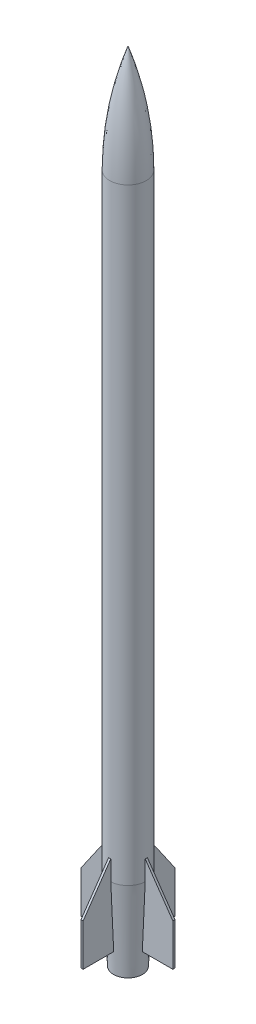
ISO-10303-21;
HEADER;
FILE_DESCRIPTION(('STEP AP214'),'2;1');
FILE_NAME('part.step','',(''),(''),'','','');
FILE_SCHEMA(('AUTOMOTIVE_DESIGN { 1 0 10303 214 1 1 1 1 }'));
ENDSEC;
DATA;
#1=APPLICATION_CONTEXT('core data for automotive mechanical design processes');
#2=APPLICATION_PROTOCOL_DEFINITION('international standard','automotive_design',2000,#1);
#3=PRODUCT_CONTEXT('',#1,'mechanical');
#4=PRODUCT('Part','Part','',(#3));
#5=PRODUCT_RELATED_PRODUCT_CATEGORY('part','',(#4));
#6=PRODUCT_DEFINITION_FORMATION('','',#4);
#7=PRODUCT_DEFINITION_CONTEXT('part definition',#1,'design');
#8=PRODUCT_DEFINITION('design','',#6,#7);
#9=PRODUCT_DEFINITION_SHAPE('','',#8);
#10=(LENGTH_UNIT() NAMED_UNIT(*) SI_UNIT(.MILLI.,.METRE.));
#11=(NAMED_UNIT(*) PLANE_ANGLE_UNIT() SI_UNIT($,.RADIAN.));
#12=(NAMED_UNIT(*) SI_UNIT($,.STERADIAN.) SOLID_ANGLE_UNIT());
#13=UNCERTAINTY_MEASURE_WITH_UNIT(LENGTH_MEASURE(1.E-05),#10,'distance_accuracy_value','');
#14=(GEOMETRIC_REPRESENTATION_CONTEXT(3) GLOBAL_UNCERTAINTY_ASSIGNED_CONTEXT((#13)) GLOBAL_UNIT_ASSIGNED_CONTEXT((#10,
#11,#12)) REPRESENTATION_CONTEXT('',''));
#15=CARTESIAN_POINT('',(0.,0.,0.));
#16=DIRECTION('',(0.,0.,1.));
#17=DIRECTION('',(1.,0.,0.));
#18=AXIS2_PLACEMENT_3D('',#15,#16,#17);
#19=CARTESIAN_POINT('',(0.,0.,0.));
#20=DIRECTION('',(0.,1.,0.));
#21=DIRECTION('',(0.,0.,1.));
#22=AXIS2_PLACEMENT_3D('',#19,#20,#21);
#23=CONICAL_SURFACE('',#22,67.1774427075302,0.046349413408035);
#24=CARTESIAN_POINT('',(0.,0.,0.));
#25=DIRECTION('',(0.,-1.,0.));
#26=DIRECTION('',(0.,0.,-1.));
#27=AXIS2_PLACEMENT_3D('',#24,#25,#26);
#28=CIRCLE('',#27,67.1774427075302);
#29=CARTESIAN_POINT('',(0.,0.,-67.1774427075302));
#30=VERTEX_POINT('',#29);
#31=EDGE_CURVE('E455',#30,#30,#28,.T.);
#32=ORIENTED_EDGE('',*,*,#31,.F.);
#33=EDGE_LOOP('',(#32));
#34=FACE_BOUND('',#33,.T.);
#35=CARTESIAN_POINT('',(0.,96.5668966320573,0.));
#36=DIRECTION('',(0.,1.,0.));
#37=DIRECTION('',(0.,0.,1.));
#38=AXIS2_PLACEMENT_3D('',#35,#36,#37);
#39=CIRCLE('',#38,71.6564695640488);
#40=CARTESIAN_POINT('',(-71.4818132841037,96.5668966320573,4.99999999999925));
#41=VERTEX_POINT('',#40);
#42=CARTESIAN_POINT('',(-71.4818132841036,96.5668966320573,-5.00000000000075));
#43=VERTEX_POINT('',#42);
#44=EDGE_CURVE('E11',#41,#43,#39,.F.);
#45=ORIENTED_EDGE('',*,*,#44,.T.);
#46=CARTESIAN_POINT('',(-57.9750402278013,-193.762006505524,-5.00000000000061));
#47=CARTESIAN_POINT('',(-58.8371322213057,-175.244223035105,-5.00000000000062));
#48=CARTESIAN_POINT('',(-59.6990829055756,-156.726432986679,-5.00000000000062));
#49=CARTESIAN_POINT('',(-61.4227352579049,-119.69084130317,-5.00000000000064));
#50=CARTESIAN_POINT('',(-62.2844369259642,-101.173039668088,-5.00000000000065));
#51=CARTESIAN_POINT('',(-66.5924067337392,-8.58400639875648,-5.0000000000007));
#52=CARTESIAN_POINT('',(-70.0370592707224,65.4873004062427,-5.00000000000073));
#53=CARTESIAN_POINT('',(-76.9241891247808,213.630015157024,-5.0000000000008));
#54=CARTESIAN_POINT('',(-80.3666664418551,287.701423102805,-5.00000000000084));
#55=CARTESIAN_POINT('',(-86.2308342244807,413.907286487323,-5.0000000000009));
#56=CARTESIAN_POINT('',(-88.6528983562522,466.04172456421,-5.00000000000093));
#57=CARTESIAN_POINT('',(-93.4964436197574,570.310627765177,-5.00000000000098));
#58=CARTESIAN_POINT('',(-95.9179247514915,622.445092889256,-5.00000000000101));
#59=CARTESIAN_POINT('',(-98.3391897240224,674.579568050675,-5.00000000000103));
#60=B_SPLINE_CURVE_WITH_KNOTS('',3,(#46,#47,#48,#49,#50,#51,#52,#53,#54,#55,#56,#57,#58,#59),
.UNSPECIFIED.,.F.,.F.,(4,2,2,2,2,2,4),(0.,55.6135196260521,111.22703924389,333.681117826368,
556.135196501042,712.70720630219,869.279215998856),.UNSPECIFIED.);
#61=CARTESIAN_POINT('',(-84.8528137423858,384.250664913094,-5.00000000000089));
#62=VERTEX_POINT('',#61);
#63=EDGE_CURVE('E194',#43,#62,#60,.T.);
#64=ORIENTED_EDGE('',*,*,#63,.T.);
#65=CARTESIAN_POINT('',(0.,384.250664913094,0.));
#66=DIRECTION('',(0.,-1.,0.));
#67=DIRECTION('',(0.,0.,-1.));
#68=AXIS2_PLACEMENT_3D('',#65,#66,#67);
#69=CIRCLE('',#68,85.0000000000002);
#70=CARTESIAN_POINT('',(-5.00000000000001,384.250664913094,-84.8528137423859));
#71=VERTEX_POINT('',#70);
#72=EDGE_CURVE('E400',#62,#71,#69,.T.);
#73=ORIENTED_EDGE('',*,*,#72,.T.);
#74=CARTESIAN_POINT('',(-5.,-193.762006505524,-57.9750402278013));
#75=CARTESIAN_POINT('',(-5.,-175.244223035105,-58.8371322213058));
#76=CARTESIAN_POINT('',(-5.,-156.726432986679,-59.6990829055757));
#77=CARTESIAN_POINT('',(-5.,-119.69084130317,-61.4227352579049));
#78=CARTESIAN_POINT('',(-5.,-101.173039668088,-62.2844369259643));
#79=CARTESIAN_POINT('',(-5.,-8.58400639875648,-66.5924067337392));
#80=CARTESIAN_POINT('',(-5.,65.4873004062427,-70.0370592707225));
#81=CARTESIAN_POINT('',(-5.,213.630015157024,-76.9241891247809));
#82=CARTESIAN_POINT('',(-5.,287.701423102805,-80.3666664418551));
#83=CARTESIAN_POINT('',(-5.,413.907286487323,-86.2308342244808));
#84=CARTESIAN_POINT('',(-5.,466.04172456421,-88.6528983562522));
#85=CARTESIAN_POINT('',(-5.,570.310627765177,-93.4964436197574));
#86=CARTESIAN_POINT('',(-5.,622.445092889256,-95.9179247514916));
#87=CARTESIAN_POINT('',(-5.,674.579568050675,-98.3391897240225));
#88=B_SPLINE_CURVE_WITH_KNOTS('',3,(#74,#75,#76,#77,#78,#79,#80,#81,#82,#83,#84,#85,#86,#87),
.UNSPECIFIED.,.F.,.F.,(4,2,2,2,2,2,4),(0.,55.6135196260521,111.22703924389,333.681117826368,
556.135196501042,712.70720630219,869.279215998856),.UNSPECIFIED.);
#89=CARTESIAN_POINT('',(-5.,96.5668966320573,-71.4818132841036));
#90=VERTEX_POINT('',#89);
#91=EDGE_CURVE('E365',#90,#71,#88,.T.);
#92=ORIENTED_EDGE('',*,*,#91,.F.);
#93=CARTESIAN_POINT('',(0.,96.5668966320573,0.));
#94=DIRECTION('',(0.,1.,0.));
#95=DIRECTION('',(0.,0.,1.));
#96=AXIS2_PLACEMENT_3D('',#93,#94,#95);
#97=CIRCLE('',#96,71.6564695640488);
#98=CARTESIAN_POINT('',(5.,96.5668966320573,-71.4818132841036));
#99=VERTEX_POINT('',#98);
#100=EDGE_CURVE('E444',#90,#99,#97,.F.);
#101=ORIENTED_EDGE('',*,*,#100,.T.);
#102=CARTESIAN_POINT('',(5.,-193.762006505524,-57.9750402278013));
#103=CARTESIAN_POINT('',(5.,-175.244223035105,-58.8371322213058));
#104=CARTESIAN_POINT('',(5.,-156.726432986679,-59.6990829055757));
#105=CARTESIAN_POINT('',(5.,-119.69084130317,-61.4227352579049));
#106=CARTESIAN_POINT('',(5.,-101.173039668088,-62.2844369259643));
#107=CARTESIAN_POINT('',(5.,-8.58400639875648,-66.5924067337392));
#108=CARTESIAN_POINT('',(5.,65.4873004062427,-70.0370592707225));
#109=CARTESIAN_POINT('',(5.,213.630015157024,-76.9241891247809));
#110=CARTESIAN_POINT('',(5.,287.701423102805,-80.3666664418551));
#111=CARTESIAN_POINT('',(5.,413.907286487323,-86.2308342244808));
#112=CARTESIAN_POINT('',(5.,466.04172456421,-88.6528983562522));
#113=CARTESIAN_POINT('',(5.,570.310627765177,-93.4964436197574));
#114=CARTESIAN_POINT('',(5.,622.445092889256,-95.9179247514916));
#115=CARTESIAN_POINT('',(5.,674.579568050675,-98.3391897240225));
#116=B_SPLINE_CURVE_WITH_KNOTS('',3,(#102,#103,#104,#105,#106,#107,#108,#109,#110,#111,#112,
#113,#114,#115),.UNSPECIFIED.,.F.,.F.,(4,2,2,2,2,2,4),(0.,55.6135196260521,111.22703924389,
333.681117826368,556.135196501042,712.70720630219,869.279215998856),.UNSPECIFIED.);
#117=CARTESIAN_POINT('',(5.00000000000001,384.250664913094,-84.8528137423859));
#118=VERTEX_POINT('',#117);
#119=EDGE_CURVE('E356',#99,#118,#116,.T.);
#120=ORIENTED_EDGE('',*,*,#119,.T.);
#121=CARTESIAN_POINT('',(84.8528137423859,384.250664913094,-4.99999999999971));
#122=VERTEX_POINT('',#121);
#123=EDGE_CURVE('E407',#118,#122,#69,.T.);
#124=ORIENTED_EDGE('',*,*,#123,.T.);
#125=CARTESIAN_POINT('',(57.9750402278013,-193.762006505524,-4.9999999999998));
#126=CARTESIAN_POINT('',(58.8371322213058,-175.244223035105,-4.99999999999979));
#127=CARTESIAN_POINT('',(59.6990829055757,-156.726432986679,-4.99999999999979));
#128=CARTESIAN_POINT('',(61.422735257905,-119.69084130317,-4.99999999999979));
#129=CARTESIAN_POINT('',(62.2844369259643,-101.173039668088,-4.99999999999978));
#130=CARTESIAN_POINT('',(66.5924067337392,-8.58400639875648,-4.99999999999977));
#131=CARTESIAN_POINT('',(70.0370592707225,65.4873004062427,-4.99999999999976));
#132=CARTESIAN_POINT('',(76.9241891247809,213.630015157024,-4.99999999999973));
#133=CARTESIAN_POINT('',(80.3666664418551,287.701423102805,-4.99999999999972));
#134=CARTESIAN_POINT('',(86.2308342244808,413.907286487323,-4.9999999999997));
#135=CARTESIAN_POINT('',(88.6528983562522,466.04172456421,-4.99999999999969));
#136=CARTESIAN_POINT('',(93.4964436197574,570.310627765177,-4.99999999999967));
#137=CARTESIAN_POINT('',(95.9179247514916,622.445092889256,-4.99999999999966));
#138=CARTESIAN_POINT('',(98.3391897240225,674.579568050675,-4.99999999999966));
#139=B_SPLINE_CURVE_WITH_KNOTS('',3,(#125,#126,#127,#128,#129,#130,#131,#132,#133,#134,#135,
#136,#137,#138),.UNSPECIFIED.,.F.,.F.,(4,2,2,2,2,2,4),(0.,55.6135196260521,111.22703924389,
333.681117826368,556.135196501042,712.70720630219,869.279215998856),.UNSPECIFIED.);
#140=CARTESIAN_POINT('',(71.4818132841037,96.5668966320573,-4.99999999999975));
#141=VERTEX_POINT('',#140);
#142=EDGE_CURVE('E309',#141,#122,#139,.T.);
#143=ORIENTED_EDGE('',*,*,#142,.F.);
#144=CARTESIAN_POINT('',(0.,96.5668966320573,0.));
#145=DIRECTION('',(0.,1.,0.));
#146=DIRECTION('',(0.,0.,1.));
#147=AXIS2_PLACEMENT_3D('',#144,#145,#146);
#148=CIRCLE('',#147,71.6564695640488);
#149=CARTESIAN_POINT('',(71.4818132841036,96.5668966320573,5.00000000000025));
#150=VERTEX_POINT('',#149);
#151=EDGE_CURVE('E431',#141,#150,#148,.F.);
#152=ORIENTED_EDGE('',*,*,#151,.T.);
#153=CARTESIAN_POINT('',(57.9750402278013,-193.762006505524,5.0000000000002));
#154=CARTESIAN_POINT('',(58.8371322213058,-175.244223035105,5.00000000000021));
#155=CARTESIAN_POINT('',(59.6990829055757,-156.726432986679,5.00000000000021));
#156=CARTESIAN_POINT('',(61.4227352579049,-119.69084130317,5.00000000000021));
#157=CARTESIAN_POINT('',(62.2844369259643,-101.173039668088,5.00000000000022));
#158=CARTESIAN_POINT('',(66.5924067337392,-8.58400639875648,5.00000000000023));
#159=CARTESIAN_POINT('',(70.0370592707224,65.4873004062427,5.00000000000025));
#160=CARTESIAN_POINT('',(76.9241891247809,213.630015157024,5.00000000000027));
#161=CARTESIAN_POINT('',(80.3666664418551,287.701423102805,5.00000000000028));
#162=CARTESIAN_POINT('',(86.2308342244808,413.907286487323,5.0000000000003));
#163=CARTESIAN_POINT('',(88.6528983562522,466.04172456421,5.00000000000031));
#164=CARTESIAN_POINT('',(93.4964436197574,570.310627765177,5.00000000000033));
#165=CARTESIAN_POINT('',(95.9179247514916,622.445092889256,5.00000000000034));
#166=CARTESIAN_POINT('',(98.3391897240225,674.579568050675,5.00000000000034));
#167=B_SPLINE_CURVE_WITH_KNOTS('',3,(#153,#154,#155,#156,#157,#158,#159,#160,#161,#162,#163,
#164,#165,#166),.UNSPECIFIED.,.F.,.F.,(4,2,2,2,2,2,4),(0.,55.6135196260521,111.22703924389,
333.681117826368,556.135196501042,712.70720630219,869.279215998856),.UNSPECIFIED.);
#168=CARTESIAN_POINT('',(84.8528137423859,384.250664913094,5.0000000000003));
#169=VERTEX_POINT('',#168);
#170=EDGE_CURVE('E318',#150,#169,#167,.T.);
#171=ORIENTED_EDGE('',*,*,#170,.T.);
#172=CARTESIAN_POINT('',(5.00000000000001,384.250664913094,84.8528137423859));
#173=VERTEX_POINT('',#172);
#174=EDGE_CURVE('E460',#169,#173,#69,.T.);
#175=ORIENTED_EDGE('',*,*,#174,.T.);
#176=CARTESIAN_POINT('',(5.,-193.762006505524,57.9750402278013));
#177=CARTESIAN_POINT('',(5.,-175.244223035105,58.8371322213058));
#178=CARTESIAN_POINT('',(5.,-156.726432986679,59.6990829055757));
#179=CARTESIAN_POINT('',(5.,-119.69084130317,61.4227352579049));
#180=CARTESIAN_POINT('',(5.,-101.173039668088,62.2844369259643));
#181=CARTESIAN_POINT('',(5.,-8.58400639875648,66.5924067337392));
#182=CARTESIAN_POINT('',(5.,65.4873004062427,70.0370592707225));
#183=CARTESIAN_POINT('',(5.,213.630015157024,76.9241891247809));
#184=CARTESIAN_POINT('',(5.,287.701423102805,80.3666664418551));
#185=CARTESIAN_POINT('',(5.,413.907286487323,86.2308342244808));
#186=CARTESIAN_POINT('',(5.,466.04172456421,88.6528983562522));
#187=CARTESIAN_POINT('',(5.,570.310627765177,93.4964436197574));
#188=CARTESIAN_POINT('',(5.,622.445092889256,95.9179247514916));
#189=CARTESIAN_POINT('',(5.,674.579568050675,98.3391897240225));
#190=B_SPLINE_CURVE_WITH_KNOTS('',3,(#176,#177,#178,#179,#180,#181,#182,#183,#184,#185,#186,
#187,#188,#189),.UNSPECIFIED.,.F.,.F.,(4,2,2,2,2,2,4),(0.,55.6135196260521,111.22703924389,
333.681117826368,556.135196501042,712.70720630219,869.279215998856),.UNSPECIFIED.);
#191=CARTESIAN_POINT('',(5.,96.5668966320573,71.4818132841036));
#192=VERTEX_POINT('',#191);
#193=EDGE_CURVE('E276',#192,#173,#190,.T.);
#194=ORIENTED_EDGE('',*,*,#193,.F.);
#195=CARTESIAN_POINT('',(0.,96.5668966320573,0.));
#196=DIRECTION('',(0.,1.,0.));
#197=DIRECTION('',(0.,0.,1.));
#198=AXIS2_PLACEMENT_3D('',#195,#196,#197);
#199=CIRCLE('',#198,71.6564695640488);
#200=CARTESIAN_POINT('',(-5.,96.5668966320573,71.4818132841036));
#201=VERTEX_POINT('',#200);
#202=EDGE_CURVE('E418',#192,#201,#199,.F.);
#203=ORIENTED_EDGE('',*,*,#202,.T.);
#204=CARTESIAN_POINT('',(-5.,-193.762006505524,57.9750402278013));
#205=CARTESIAN_POINT('',(-5.,-175.244223035105,58.8371322213058));
#206=CARTESIAN_POINT('',(-5.,-156.726432986679,59.6990829055757));
#207=CARTESIAN_POINT('',(-5.,-119.69084130317,61.4227352579049));
#208=CARTESIAN_POINT('',(-5.,-101.173039668088,62.2844369259643));
#209=CARTESIAN_POINT('',(-5.,-8.58400639875648,66.5924067337392));
#210=CARTESIAN_POINT('',(-5.,65.4873004062427,70.0370592707225));
#211=CARTESIAN_POINT('',(-5.,213.630015157024,76.9241891247809));
#212=CARTESIAN_POINT('',(-5.,287.701423102805,80.3666664418551));
#213=CARTESIAN_POINT('',(-5.,413.907286487323,86.2308342244808));
#214=CARTESIAN_POINT('',(-5.,466.04172456421,88.6528983562522));
#215=CARTESIAN_POINT('',(-5.,570.310627765177,93.4964436197574));
#216=CARTESIAN_POINT('',(-5.,622.445092889256,95.9179247514916));
#217=CARTESIAN_POINT('',(-5.,674.579568050675,98.3391897240225));
#218=B_SPLINE_CURVE_WITH_KNOTS('',3,(#204,#205,#206,#207,#208,#209,#210,#211,#212,#213,#214,
#215,#216,#217),.UNSPECIFIED.,.F.,.F.,(4,2,2,2,2,2,4),(0.,55.6135196260521,111.22703924389,
333.681117826368,556.135196501042,712.70720630219,869.279215998856),.UNSPECIFIED.);
#219=CARTESIAN_POINT('',(-5.00000000000001,384.250664913094,84.8528137423859));
#220=VERTEX_POINT('',#219);
#221=EDGE_CURVE('E267',#201,#220,#218,.T.);
#222=ORIENTED_EDGE('',*,*,#221,.T.);
#223=CARTESIAN_POINT('',(-84.852813742386,384.250664913094,4.99999999999912));
#224=VERTEX_POINT('',#223);
#225=EDGE_CURVE('E406',#220,#224,#69,.T.);
#226=ORIENTED_EDGE('',*,*,#225,.T.);
#227=CARTESIAN_POINT('',(-57.9750402278014,-193.762006505524,4.99999999999939));
#228=CARTESIAN_POINT('',(-58.8371322213058,-175.244223035105,4.99999999999938));
#229=CARTESIAN_POINT('',(-59.6990829055758,-156.726432986679,4.99999999999938));
#230=CARTESIAN_POINT('',(-61.422735257905,-119.69084130317,4.99999999999936));
#231=CARTESIAN_POINT('',(-62.2844369259643,-101.173039668088,4.99999999999935));
#232=CARTESIAN_POINT('',(-66.5924067337393,-8.58400639875651,4.9999999999993));
#233=CARTESIAN_POINT('',(-70.0370592707225,65.4873004062427,4.99999999999927));
#234=CARTESIAN_POINT('',(-76.9241891247809,213.630015157024,4.9999999999992));
#235=CARTESIAN_POINT('',(-80.3666664418552,287.701423102805,4.99999999999916));
#236=CARTESIAN_POINT('',(-86.2308342244808,413.907286487323,4.9999999999991));
#237=CARTESIAN_POINT('',(-88.6528983562523,466.04172456421,4.99999999999907));
#238=CARTESIAN_POINT('',(-93.4964436197575,570.310627765177,4.99999999999902));
#239=CARTESIAN_POINT('',(-95.9179247514917,622.445092889256,4.99999999999899));
#240=CARTESIAN_POINT('',(-98.3391897240225,674.579568050675,4.99999999999897));
#241=B_SPLINE_CURVE_WITH_KNOTS('',3,(#227,#228,#229,#230,#231,#232,#233,#234,#235,#236,#237,
#238,#239,#240),.UNSPECIFIED.,.F.,.F.,(4,2,2,2,2,2,4),(0.,55.6135196260521,111.22703924389,
333.681117826368,556.135196501042,712.70720630219,869.279215998856),.UNSPECIFIED.);
#242=EDGE_CURVE('E68',#41,#224,#241,.T.);
#243=ORIENTED_EDGE('',*,*,#242,.F.);
#244=EDGE_LOOP('',(#45,#64,#73,#92,#101,#120,#124,#143,#152,#171,#175,#194,#203,#222,#226,#243));
#245=FACE_BOUND('',#244,.T.);
#246=ADVANCED_FACE('F49',(#34,#245),#23,.T.);
#247=CARTESIAN_POINT('',(0.,0.,0.));
#248=DIRECTION('',(0.,-1.,0.));
#249=DIRECTION('',(0.,0.,-1.));
#250=AXIS2_PLACEMENT_3D('',#247,#248,#249);
#251=CYLINDRICAL_SURFACE('',#250,85.0000000000001);
#252=CARTESIAN_POINT('',(0.,3201.22829386281,0.));
#253=DIRECTION('',(0.,-1.,0.));
#254=DIRECTION('',(0.,0.,-1.));
#255=AXIS2_PLACEMENT_3D('',#252,#253,#254);
#256=CIRCLE('',#255,85.);
#257=CARTESIAN_POINT('',(0.,3201.22829386281,-85.));
#258=VERTEX_POINT('',#257);
#259=EDGE_CURVE('E364',#258,#258,#256,.T.);
#260=ORIENTED_EDGE('',*,*,#259,.T.);
#261=EDGE_LOOP('',(#260));
#262=FACE_BOUND('',#261,.T.);
#263=ORIENTED_EDGE('',*,*,#72,.F.);
#264=DIRECTION('',(0.,-1.,0.));
#265=VECTOR('',#264,1.);
#266=CARTESIAN_POINT('',(-84.8528137423857,0.,-5.00000000000089));
#267=LINE('',#266,#265);
#268=CARTESIAN_POINT('',(-84.8528137423859,476.493606937225,-5.00000000000089));
#269=VERTEX_POINT('',#268);
#270=EDGE_CURVE('E58',#62,#269,#267,.F.);
#271=ORIENTED_EDGE('',*,*,#270,.T.);
#272=CARTESIAN_POINT('',(0.,598.887087839009,0.));
#273=DIRECTION('',(0.821818490176368,-0.569749391578644,0.));
#274=DIRECTION('',(-0.569749391578644,-0.821818490176368,0.));
#275=AXIS2_PLACEMENT_3D('',#272,#273,#274);
#276=ELLIPSE('',#275,149.188399770792,85.0000000000001);
#277=CARTESIAN_POINT('',(-84.8528137423858,476.493606937225,4.99999999999911));
#278=VERTEX_POINT('',#277);
#279=EDGE_CURVE('E409',#269,#278,#276,.F.);
#280=ORIENTED_EDGE('',*,*,#279,.T.);
#281=DIRECTION('',(0.,-1.,0.));
#282=VECTOR('',#281,1.);
#283=CARTESIAN_POINT('',(-84.8528137423858,0.,4.99999999999911));
#284=LINE('',#283,#282);
#285=EDGE_CURVE('E412',#224,#278,#284,.F.);
#286=ORIENTED_EDGE('',*,*,#285,.F.);
#287=ORIENTED_EDGE('',*,*,#225,.F.);
#288=DIRECTION('',(0.,-1.,0.));
#289=VECTOR('',#288,1.);
#290=CARTESIAN_POINT('',(-5.,0.,84.8528137423858));
#291=LINE('',#290,#289);
#292=CARTESIAN_POINT('',(-5.,476.493606937225,84.8528137423859));
#293=VERTEX_POINT('',#292);
#294=EDGE_CURVE('E421',#220,#293,#291,.F.);
#295=ORIENTED_EDGE('',*,*,#294,.T.);
#296=CARTESIAN_POINT('',(0.,598.887087839009,0.));
#297=DIRECTION('',(0.,-0.569749391578644,-0.821818490176368));
#298=DIRECTION('',(0.,-0.821818490176368,0.569749391578644));
#299=AXIS2_PLACEMENT_3D('',#296,#297,#298);
#300=ELLIPSE('',#299,149.188399770792,85.0000000000001);
#301=CARTESIAN_POINT('',(5.,476.493606937225,84.8528137423858));
#302=VERTEX_POINT('',#301);
#303=EDGE_CURVE('E424',#293,#302,#300,.F.);
#304=ORIENTED_EDGE('',*,*,#303,.T.);
#305=DIRECTION('',(0.,-1.,0.));
#306=VECTOR('',#305,1.);
#307=CARTESIAN_POINT('',(5.,0.,84.8528137423858));
#308=LINE('',#307,#306);
#309=EDGE_CURVE('E427',#173,#302,#308,.F.);
#310=ORIENTED_EDGE('',*,*,#309,.F.);
#311=ORIENTED_EDGE('',*,*,#174,.F.);
#312=DIRECTION('',(0.,-1.,0.));
#313=VECTOR('',#312,1.);
#314=CARTESIAN_POINT('',(84.8528137423858,0.,5.00000000000029));
#315=LINE('',#314,#313);
#316=CARTESIAN_POINT('',(84.8528137423859,476.493606937225,5.0000000000003));
#317=VERTEX_POINT('',#316);
#318=EDGE_CURVE('E434',#169,#317,#315,.F.);
#319=ORIENTED_EDGE('',*,*,#318,.T.);
#320=CARTESIAN_POINT('',(0.,598.887087839009,0.));
#321=DIRECTION('',(-0.821818490176368,-0.569749391578644,0.));
#322=DIRECTION('',(0.569749391578644,-0.821818490176368,0.));
#323=AXIS2_PLACEMENT_3D('',#320,#321,#322);
#324=ELLIPSE('',#323,149.188399770792,85.0000000000001);
#325=CARTESIAN_POINT('',(84.8528137423858,476.493606937225,-4.9999999999997));
#326=VERTEX_POINT('',#325);
#327=EDGE_CURVE('E437',#317,#326,#324,.F.);
#328=ORIENTED_EDGE('',*,*,#327,.T.);
#329=DIRECTION('',(0.,-1.,0.));
#330=VECTOR('',#329,1.);
#331=CARTESIAN_POINT('',(84.8528137423858,0.,-4.9999999999997));
#332=LINE('',#331,#330);
#333=EDGE_CURVE('E440',#122,#326,#332,.F.);
#334=ORIENTED_EDGE('',*,*,#333,.F.);
#335=ORIENTED_EDGE('',*,*,#123,.F.);
#336=DIRECTION('',(0.,-1.,0.));
#337=VECTOR('',#336,1.);
#338=CARTESIAN_POINT('',(5.,0.,-84.8528137423858));
#339=LINE('',#338,#337);
#340=CARTESIAN_POINT('',(5.,476.493606937225,-84.8528137423859));
#341=VERTEX_POINT('',#340);
#342=EDGE_CURVE('E447',#118,#341,#339,.F.);
#343=ORIENTED_EDGE('',*,*,#342,.T.);
#344=CARTESIAN_POINT('',(0.,598.887087839009,0.));
#345=DIRECTION('',(0.,-0.569749391578644,0.821818490176368));
#346=DIRECTION('',(0.,-0.821818490176368,-0.569749391578644));
#347=AXIS2_PLACEMENT_3D('',#344,#345,#346);
#348=ELLIPSE('',#347,149.188399770792,85.0000000000001);
#349=CARTESIAN_POINT('',(-5.,476.493606937225,-84.8528137423858));
#350=VERTEX_POINT('',#349);
#351=EDGE_CURVE('E450',#341,#350,#348,.F.);
#352=ORIENTED_EDGE('',*,*,#351,.T.);
#353=DIRECTION('',(0.,-1.,0.));
#354=VECTOR('',#353,1.);
#355=CARTESIAN_POINT('',(-5.,0.,-84.8528137423858));
#356=LINE('',#355,#354);
#357=EDGE_CURVE('E403',#71,#350,#356,.F.);
#358=ORIENTED_EDGE('',*,*,#357,.F.);
#359=EDGE_LOOP('',(#263,#271,#280,#286,#287,#295,#304,#310,#311,#319,#328,#334,#335,#343,#352,#358));
#360=FACE_BOUND('',#359,.T.);
#361=ADVANCED_FACE('F386',(#262,#360),#251,.T.);
#362=CARTESIAN_POINT('',(67.1774427075302,0.,0.));
#363=DIRECTION('',(0.,-1.,0.));
#364=DIRECTION('',(0.,0.,-1.));
#365=AXIS2_PLACEMENT_3D('',#362,#363,#364);
#366=PLANE('',#365);
#367=ORIENTED_EDGE('',*,*,#31,.T.);
#368=EDGE_LOOP('',(#367));
#369=FACE_BOUND('',#368,.T.);
#370=ADVANCED_FACE('F51',(#369),#366,.T.);
#371=CARTESIAN_POINT('',(85.,3201.22829386281,0.));
#372=CARTESIAN_POINT('',(84.8652152831492,3457.51661944344,0.));
#373=CARTESIAN_POINT('',(0.,3700.,0.));
#374=B_SPLINE_CURVE_WITH_KNOTS('',2,(#371,#372,#373),.UNSPECIFIED.,.F.,.F.,(3,3),(0.,1.),.UNSPECIFIED.);
#375=CARTESIAN_POINT('',(0.,0.,0.));
#376=DIRECTION('',(0.,-1.,0.));
#377=AXIS1_PLACEMENT('',#375,#376);
#378=SURFACE_OF_REVOLUTION('',#374,#377);
#379=CARTESIAN_POINT('',(0.,3700.,0.));
#380=VERTEX_POINT('',#379);
#381=VERTEX_LOOP('',#380);
#382=FACE_BOUND('',#381,.T.);
#383=ORIENTED_EDGE('',*,*,#259,.F.);
#384=EDGE_LOOP('',(#383));
#385=FACE_BOUND('',#384,.T.);
#386=ADVANCED_FACE('F380',(#382,#385),#378,.F.);
#387=CARTESIAN_POINT('',(5.,291.11049915778,-213.375004626202));
#388=DIRECTION('',(0.,-0.569749391578644,0.821818490176368));
#389=DIRECTION('',(0.,-0.821818490176368,-0.569749391578644));
#390=AXIS2_PLACEMENT_3D('',#387,#388,#389);
#391=PLANE('',#390);
#392=ORIENTED_EDGE('',*,*,#351,.F.);
#393=DIRECTION('',(0.,0.821818490176368,0.569749391578644));
#394=VECTOR('',#393,1.);
#395=CARTESIAN_POINT('',(5.,291.11049915778,-213.375004626202));
#396=LINE('',#395,#394);
#397=CARTESIAN_POINT('',(5.,291.11049915778,-213.375004626202));
#398=VERTEX_POINT('',#397);
#399=EDGE_CURVE('E504',#398,#341,#396,.T.);
#400=ORIENTED_EDGE('',*,*,#399,.F.);
#401=DIRECTION('',(-1.,0.,0.));
#402=VECTOR('',#401,1.);
#403=CARTESIAN_POINT('',(5.,291.11049915778,-213.375004626202));
#404=LINE('',#403,#402);
#405=CARTESIAN_POINT('',(-5.,291.11049915778,-213.375004626202));
#406=VERTEX_POINT('',#405);
#407=EDGE_CURVE('E620',#398,#406,#404,.T.);
#408=ORIENTED_EDGE('',*,*,#407,.T.);
#409=DIRECTION('',(0.,0.821818490176368,0.569749391578644));
#410=VECTOR('',#409,1.);
#411=CARTESIAN_POINT('',(-5.,291.11049915778,-213.375004626202));
#412=LINE('',#411,#410);
#413=EDGE_CURVE('E608',#406,#350,#412,.T.);
#414=ORIENTED_EDGE('',*,*,#413,.T.);
#415=EDGE_LOOP('',(#392,#400,#408,#414));
#416=FACE_BOUND('',#415,.T.);
#417=ADVANCED_FACE('F383',(#416),#391,.F.);
#418=CARTESIAN_POINT('',(5.,96.5668966320573,-45.9000596781403));
#419=DIRECTION('',(0.,1.,0.));
#420=DIRECTION('',(0.,0.,1.));
#421=AXIS2_PLACEMENT_3D('',#418,#419,#420);
#422=PLANE('',#421);
#423=ORIENTED_EDGE('',*,*,#100,.F.);
#424=DIRECTION('',(0.,0.,-1.));
#425=VECTOR('',#424,1.);
#426=CARTESIAN_POINT('',(-5.,96.5668966320573,-45.9000596781403));
#427=LINE('',#426,#425);
#428=CARTESIAN_POINT('',(-5.,96.5668966320573,-213.375004626202));
#429=VERTEX_POINT('',#428);
#430=EDGE_CURVE('E918',#90,#429,#427,.T.);
#431=ORIENTED_EDGE('',*,*,#430,.T.);
#432=DIRECTION('',(-1.,0.,0.));
#433=VECTOR('',#432,1.);
#434=CARTESIAN_POINT('',(5.,96.5668966320573,-213.375004626202));
#435=LINE('',#434,#433);
#436=CARTESIAN_POINT('',(5.,96.5668966320573,-213.375004626202));
#437=VERTEX_POINT('',#436);
#438=EDGE_CURVE('E929',#437,#429,#435,.T.);
#439=ORIENTED_EDGE('',*,*,#438,.F.);
#440=DIRECTION('',(0.,0.,-1.));
#441=VECTOR('',#440,1.);
#442=CARTESIAN_POINT('',(5.,96.5668966320573,-45.9000596781403));
#443=LINE('',#442,#441);
#444=EDGE_CURVE('E500',#99,#437,#443,.T.);
#445=ORIENTED_EDGE('',*,*,#444,.F.);
#446=EDGE_LOOP('',(#423,#431,#439,#445));
#447=FACE_BOUND('',#446,.T.);
#448=ADVANCED_FACE('F718',(#447),#422,.F.);
#449=CARTESIAN_POINT('',(5.,96.5668966320573,-213.375004626202));
#450=DIRECTION('',(0.,0.,1.));
#451=DIRECTION('',(1.,0.,0.));
#452=AXIS2_PLACEMENT_3D('',#449,#450,#451);
#453=PLANE('',#452);
#454=DIRECTION('',(0.,1.,0.));
#455=VECTOR('',#454,1.);
#456=CARTESIAN_POINT('',(-5.,96.5668966320573,-213.375004626202));
#457=LINE('',#456,#455);
#458=EDGE_CURVE('E613',#429,#406,#457,.T.);
#459=ORIENTED_EDGE('',*,*,#458,.T.);
#460=ORIENTED_EDGE('',*,*,#407,.F.);
#461=DIRECTION('',(0.,1.,0.));
#462=VECTOR('',#461,1.);
#463=CARTESIAN_POINT('',(5.,96.5668966320573,-213.375004626202));
#464=LINE('',#463,#462);
#465=EDGE_CURVE('E503',#437,#398,#464,.T.);
#466=ORIENTED_EDGE('',*,*,#465,.F.);
#467=ORIENTED_EDGE('',*,*,#438,.T.);
#468=EDGE_LOOP('',(#459,#460,#466,#467));
#469=FACE_BOUND('',#468,.T.);
#470=ADVANCED_FACE('F351',(#469),#453,.F.);
#471=CARTESIAN_POINT('',(5.,0.,0.));
#472=DIRECTION('',(-1.,0.,0.));
#473=DIRECTION('',(0.,0.,1.));
#474=AXIS2_PLACEMENT_3D('',#471,#472,#473);
#475=PLANE('',#474);
#476=ORIENTED_EDGE('',*,*,#119,.F.);
#477=ORIENTED_EDGE('',*,*,#444,.T.);
#478=ORIENTED_EDGE('',*,*,#465,.T.);
#479=ORIENTED_EDGE('',*,*,#399,.T.);
#480=ORIENTED_EDGE('',*,*,#342,.F.);
#481=EDGE_LOOP('',(#476,#477,#478,#479,#480));
#482=FACE_BOUND('',#481,.T.);
#483=ADVANCED_FACE('F347',(#482),#475,.F.);
#484=CARTESIAN_POINT('',(-5.,0.,0.));
#485=DIRECTION('',(-1.,0.,0.));
#486=DIRECTION('',(0.,0.,1.));
#487=AXIS2_PLACEMENT_3D('',#484,#485,#486);
#488=PLANE('',#487);
#489=ORIENTED_EDGE('',*,*,#430,.F.);
#490=ORIENTED_EDGE('',*,*,#91,.T.);
#491=ORIENTED_EDGE('',*,*,#357,.T.);
#492=ORIENTED_EDGE('',*,*,#413,.F.);
#493=ORIENTED_EDGE('',*,*,#458,.F.);
#494=EDGE_LOOP('',(#489,#490,#491,#492,#493));
#495=FACE_BOUND('',#494,.T.);
#496=ADVANCED_FACE('F345',(#495),#488,.T.);
#497=CARTESIAN_POINT('',(213.375004626202,291.11049915778,5.00000000000075));
#498=DIRECTION('',(-0.821818490176368,-0.569749391578644,0.));
#499=DIRECTION('',(0.569749391578644,-0.821818490176368,0.));
#500=AXIS2_PLACEMENT_3D('',#497,#498,#499);
#501=PLANE('',#500);
#502=ORIENTED_EDGE('',*,*,#327,.F.);
#503=DIRECTION('',(-0.569749391578644,0.821818490176368,0.));
#504=VECTOR('',#503,1.);
#505=CARTESIAN_POINT('',(213.375004626202,291.11049915778,5.00000000000075));
#506=LINE('',#505,#504);
#507=CARTESIAN_POINT('',(213.375004626202,291.11049915778,5.00000000000075));
#508=VERTEX_POINT('',#507);
#509=EDGE_CURVE('E282',#508,#317,#506,.T.);
#510=ORIENTED_EDGE('',*,*,#509,.F.);
#511=DIRECTION('',(0.,0.,-1.));
#512=VECTOR('',#511,1.);
#513=CARTESIAN_POINT('',(213.375004626202,291.11049915778,5.00000000000075));
#514=LINE('',#513,#512);
#515=CARTESIAN_POINT('',(213.375004626202,291.11049915778,-4.99999999999925));
#516=VERTEX_POINT('',#515);
#517=EDGE_CURVE('E293',#508,#516,#514,.T.);
#518=ORIENTED_EDGE('',*,*,#517,.T.);
#519=DIRECTION('',(-0.569749391578644,0.821818490176368,0.));
#520=VECTOR('',#519,1.);
#521=CARTESIAN_POINT('',(213.375004626202,291.11049915778,-4.99999999999925));
#522=LINE('',#521,#520);
#523=EDGE_CURVE('E275',#516,#326,#522,.T.);
#524=ORIENTED_EDGE('',*,*,#523,.T.);
#525=EDGE_LOOP('',(#502,#510,#518,#524));
#526=FACE_BOUND('',#525,.T.);
#527=ADVANCED_FACE('F341',(#526),#501,.F.);
#528=CARTESIAN_POINT('',(45.9000596781403,96.5668966320573,5.00000000000016));
#529=DIRECTION('',(0.,1.,0.));
#530=DIRECTION('',(0.,0.,1.));
#531=AXIS2_PLACEMENT_3D('',#528,#529,#530);
#532=PLANE('',#531);
#533=ORIENTED_EDGE('',*,*,#151,.F.);
#534=DIRECTION('',(1.,0.,0.));
#535=VECTOR('',#534,1.);
#536=CARTESIAN_POINT('',(45.9000596781403,96.5668966320573,-4.99999999999984));
#537=LINE('',#536,#535);
#538=CARTESIAN_POINT('',(213.375004626202,96.5668966320573,-4.99999999999925));
#539=VERTEX_POINT('',#538);
#540=EDGE_CURVE('E297',#141,#539,#537,.T.);
#541=ORIENTED_EDGE('',*,*,#540,.T.);
#542=DIRECTION('',(0.,0.,-1.));
#543=VECTOR('',#542,1.);
#544=CARTESIAN_POINT('',(213.375004626202,96.5668966320573,5.00000000000075));
#545=LINE('',#544,#543);
#546=CARTESIAN_POINT('',(213.375004626202,96.5668966320573,5.00000000000075));
#547=VERTEX_POINT('',#546);
#548=EDGE_CURVE('E305',#547,#539,#545,.T.);
#549=ORIENTED_EDGE('',*,*,#548,.F.);
#550=DIRECTION('',(1.,0.,0.));
#551=VECTOR('',#550,1.);
#552=CARTESIAN_POINT('',(45.9000596781403,96.5668966320573,5.00000000000016));
#553=LINE('',#552,#551);
#554=EDGE_CURVE('E286',#150,#547,#553,.T.);
#555=ORIENTED_EDGE('',*,*,#554,.F.);
#556=EDGE_LOOP('',(#533,#541,#549,#555));
#557=FACE_BOUND('',#556,.T.);
#558=ADVANCED_FACE('F337',(#557),#532,.F.);
#559=CARTESIAN_POINT('',(213.375004626202,96.5668966320573,5.00000000000075));
#560=DIRECTION('',(-1.,0.,0.));
#561=DIRECTION('',(0.,0.,1.));
#562=AXIS2_PLACEMENT_3D('',#559,#560,#561);
#563=PLANE('',#562);
#564=DIRECTION('',(0.,1.,0.));
#565=VECTOR('',#564,1.);
#566=CARTESIAN_POINT('',(213.375004626202,96.5668966320573,-4.99999999999925));
#567=LINE('',#566,#565);
#568=EDGE_CURVE('E287',#539,#516,#567,.T.);
#569=ORIENTED_EDGE('',*,*,#568,.T.);
#570=ORIENTED_EDGE('',*,*,#517,.F.);
#571=DIRECTION('',(0.,1.,0.));
#572=VECTOR('',#571,1.);
#573=CARTESIAN_POINT('',(213.375004626202,96.5668966320573,5.00000000000075));
#574=LINE('',#573,#572);
#575=EDGE_CURVE('E290',#547,#508,#574,.T.);
#576=ORIENTED_EDGE('',*,*,#575,.F.);
#577=ORIENTED_EDGE('',*,*,#548,.T.);
#578=EDGE_LOOP('',(#569,#570,#576,#577));
#579=FACE_BOUND('',#578,.T.);
#580=ADVANCED_FACE('F334',(#579),#563,.F.);
#581=CARTESIAN_POINT('',(0.,0.,5.));
#582=DIRECTION('',(0.,0.,-1.));
#583=DIRECTION('',(-1.,0.,0.));
#584=AXIS2_PLACEMENT_3D('',#581,#582,#583);
#585=PLANE('',#584);
#586=ORIENTED_EDGE('',*,*,#170,.F.);
#587=ORIENTED_EDGE('',*,*,#554,.T.);
#588=ORIENTED_EDGE('',*,*,#575,.T.);
#589=ORIENTED_EDGE('',*,*,#509,.T.);
#590=ORIENTED_EDGE('',*,*,#318,.F.);
#591=EDGE_LOOP('',(#586,#587,#588,#589,#590));
#592=FACE_BOUND('',#591,.T.);
#593=ADVANCED_FACE('F330',(#592),#585,.F.);
#594=CARTESIAN_POINT('',(0.,0.,-5.));
#595=DIRECTION('',(0.,0.,-1.));
#596=DIRECTION('',(-1.,0.,0.));
#597=AXIS2_PLACEMENT_3D('',#594,#595,#596);
#598=PLANE('',#597);
#599=ORIENTED_EDGE('',*,*,#540,.F.);
#600=ORIENTED_EDGE('',*,*,#142,.T.);
#601=ORIENTED_EDGE('',*,*,#333,.T.);
#602=ORIENTED_EDGE('',*,*,#523,.F.);
#603=ORIENTED_EDGE('',*,*,#568,.F.);
#604=EDGE_LOOP('',(#599,#600,#601,#602,#603));
#605=FACE_BOUND('',#604,.T.);
#606=ADVANCED_FACE('F325',(#605),#598,.T.);
#607=CARTESIAN_POINT('',(-5.,291.11049915778,213.375004626202));
#608=DIRECTION('',(0.,-0.569749391578644,-0.821818490176368));
#609=DIRECTION('',(0.,0.821818490176368,-0.569749391578644));
#610=AXIS2_PLACEMENT_3D('',#607,#608,#609);
#611=PLANE('',#610);
#612=ORIENTED_EDGE('',*,*,#303,.F.);
#613=DIRECTION('',(0.,0.821818490176368,-0.569749391578644));
#614=VECTOR('',#613,1.);
#615=CARTESIAN_POINT('',(-5.,291.11049915778,213.375004626202));
#616=LINE('',#615,#614);
#617=CARTESIAN_POINT('',(-5.,291.11049915778,213.375004626202));
#618=VERTEX_POINT('',#617);
#619=EDGE_CURVE('E543',#618,#293,#616,.T.);
#620=ORIENTED_EDGE('',*,*,#619,.F.);
#621=DIRECTION('',(1.,0.,0.));
#622=VECTOR('',#621,1.);
#623=CARTESIAN_POINT('',(-5.,291.11049915778,213.375004626202));
#624=LINE('',#623,#622);
#625=CARTESIAN_POINT('',(5.,291.11049915778,213.375004626202));
#626=VERTEX_POINT('',#625);
#627=EDGE_CURVE('E497',#618,#626,#624,.T.);
#628=ORIENTED_EDGE('',*,*,#627,.T.);
#629=DIRECTION('',(0.,0.821818490176368,-0.569749391578644));
#630=VECTOR('',#629,1.);
#631=CARTESIAN_POINT('',(5.,291.11049915778,213.375004626202));
#632=LINE('',#631,#630);
#633=EDGE_CURVE('E511',#626,#302,#632,.T.);
#634=ORIENTED_EDGE('',*,*,#633,.T.);
#635=EDGE_LOOP('',(#612,#620,#628,#634));
#636=FACE_BOUND('',#635,.T.);
#637=ADVANCED_FACE('F329',(#636),#611,.F.);
#638=CARTESIAN_POINT('',(-5.,96.5668966320573,45.9000596781403));
#639=DIRECTION('',(0.,1.,0.));
#640=DIRECTION('',(0.,0.,1.));
#641=AXIS2_PLACEMENT_3D('',#638,#639,#640);
#642=PLANE('',#641);
#643=ORIENTED_EDGE('',*,*,#202,.F.);
#644=DIRECTION('',(0.,0.,1.));
#645=VECTOR('',#644,1.);
#646=CARTESIAN_POINT('',(5.,96.5668966320573,45.9000596781403));
#647=LINE('',#646,#645);
#648=CARTESIAN_POINT('',(5.,96.5668966320573,213.375004626202));
#649=VERTEX_POINT('',#648);
#650=EDGE_CURVE('E515',#192,#649,#647,.T.);
#651=ORIENTED_EDGE('',*,*,#650,.T.);
#652=DIRECTION('',(1.,0.,0.));
#653=VECTOR('',#652,1.);
#654=CARTESIAN_POINT('',(-5.,96.5668966320573,213.375004626202));
#655=LINE('',#654,#653);
#656=CARTESIAN_POINT('',(-5.,96.5668966320573,213.375004626202));
#657=VERTEX_POINT('',#656);
#658=EDGE_CURVE('E490',#657,#649,#655,.T.);
#659=ORIENTED_EDGE('',*,*,#658,.F.);
#660=DIRECTION('',(0.,0.,1.));
#661=VECTOR('',#660,1.);
#662=CARTESIAN_POINT('',(-5.,96.5668966320573,45.9000596781403));
#663=LINE('',#662,#661);
#664=EDGE_CURVE('E550',#201,#657,#663,.T.);
#665=ORIENTED_EDGE('',*,*,#664,.F.);
#666=EDGE_LOOP('',(#643,#651,#659,#665));
#667=FACE_BOUND('',#666,.T.);
#668=ADVANCED_FACE('F809',(#667),#642,.F.);
#669=CARTESIAN_POINT('',(-5.,96.5668966320573,213.375004626202));
#670=DIRECTION('',(0.,0.,-1.));
#671=DIRECTION('',(-1.,0.,0.));
#672=AXIS2_PLACEMENT_3D('',#669,#670,#671);
#673=PLANE('',#672);
#674=DIRECTION('',(0.,1.,0.));
#675=VECTOR('',#674,1.);
#676=CARTESIAN_POINT('',(5.,96.5668966320573,213.375004626202));
#677=LINE('',#676,#675);
#678=EDGE_CURVE('E538',#649,#626,#677,.T.);
#679=ORIENTED_EDGE('',*,*,#678,.T.);
#680=ORIENTED_EDGE('',*,*,#627,.F.);
#681=DIRECTION('',(0.,1.,0.));
#682=VECTOR('',#681,1.);
#683=CARTESIAN_POINT('',(-5.,96.5668966320573,213.375004626202));
#684=LINE('',#683,#682);
#685=EDGE_CURVE('E553',#657,#618,#684,.T.);
#686=ORIENTED_EDGE('',*,*,#685,.F.);
#687=ORIENTED_EDGE('',*,*,#658,.T.);
#688=EDGE_LOOP('',(#679,#680,#686,#687));
#689=FACE_BOUND('',#688,.T.);
#690=ADVANCED_FACE('F262',(#689),#673,.F.);
#691=CARTESIAN_POINT('',(-5.,0.,0.));
#692=DIRECTION('',(1.,0.,0.));
#693=DIRECTION('',(0.,0.,-1.));
#694=AXIS2_PLACEMENT_3D('',#691,#692,#693);
#695=PLANE('',#694);
#696=ORIENTED_EDGE('',*,*,#221,.F.);
#697=ORIENTED_EDGE('',*,*,#664,.T.);
#698=ORIENTED_EDGE('',*,*,#685,.T.);
#699=ORIENTED_EDGE('',*,*,#619,.T.);
#700=ORIENTED_EDGE('',*,*,#294,.F.);
#701=EDGE_LOOP('',(#696,#697,#698,#699,#700));
#702=FACE_BOUND('',#701,.T.);
#703=ADVANCED_FACE('F258',(#702),#695,.F.);
#704=CARTESIAN_POINT('',(5.,0.,0.));
#705=DIRECTION('',(1.,0.,0.));
#706=DIRECTION('',(0.,0.,-1.));
#707=AXIS2_PLACEMENT_3D('',#704,#705,#706);
#708=PLANE('',#707);
#709=ORIENTED_EDGE('',*,*,#650,.F.);
#710=ORIENTED_EDGE('',*,*,#193,.T.);
#711=ORIENTED_EDGE('',*,*,#309,.T.);
#712=ORIENTED_EDGE('',*,*,#633,.F.);
#713=ORIENTED_EDGE('',*,*,#678,.F.);
#714=EDGE_LOOP('',(#709,#710,#711,#712,#713));
#715=FACE_BOUND('',#714,.T.);
#716=ADVANCED_FACE('F256',(#715),#708,.T.);
#717=CARTESIAN_POINT('',(-213.375004626202,291.11049915778,-5.00000000000224));
#718=DIRECTION('',(0.821818490176368,-0.569749391578644,0.));
#719=DIRECTION('',(0.569749391578644,0.821818490176368,0.));
#720=AXIS2_PLACEMENT_3D('',#717,#718,#719);
#721=PLANE('',#720);
#722=ORIENTED_EDGE('',*,*,#279,.F.);
#723=DIRECTION('',(0.569749391578644,0.821818490176368,0.));
#724=VECTOR('',#723,1.);
#725=CARTESIAN_POINT('',(-213.375004626202,291.11049915778,-5.00000000000224));
#726=LINE('',#725,#724);
#727=CARTESIAN_POINT('',(-213.375004626202,291.11049915778,-5.00000000000224));
#728=VERTEX_POINT('',#727);
#729=EDGE_CURVE('E197',#728,#269,#726,.T.);
#730=ORIENTED_EDGE('',*,*,#729,.F.);
#731=DIRECTION('',(0.,0.,1.));
#732=VECTOR('',#731,1.);
#733=CARTESIAN_POINT('',(-213.375004626202,291.11049915778,-5.00000000000224));
#734=LINE('',#733,#732);
#735=CARTESIAN_POINT('',(-213.375004626202,291.11049915778,4.99999999999777));
#736=VERTEX_POINT('',#735);
#737=EDGE_CURVE('E207',#728,#736,#734,.T.);
#738=ORIENTED_EDGE('',*,*,#737,.T.);
#739=DIRECTION('',(0.569749391578644,0.821818490176368,0.));
#740=VECTOR('',#739,1.);
#741=CARTESIAN_POINT('',(-213.375004626202,291.11049915778,4.99999999999777));
#742=LINE('',#741,#740);
#743=EDGE_CURVE('E219',#736,#278,#742,.T.);
#744=ORIENTED_EDGE('',*,*,#743,.T.);
#745=EDGE_LOOP('',(#722,#730,#738,#744));
#746=FACE_BOUND('',#745,.T.);
#747=ADVANCED_FACE('F253',(#746),#721,.F.);
#748=CARTESIAN_POINT('',(-45.9000596781403,96.5668966320573,-5.00000000000048));
#749=DIRECTION('',(0.,1.,0.));
#750=DIRECTION('',(0.,0.,1.));
#751=AXIS2_PLACEMENT_3D('',#748,#749,#750);
#752=PLANE('',#751);
#753=ORIENTED_EDGE('',*,*,#44,.F.);
#754=DIRECTION('',(-1.,0.,0.));
#755=VECTOR('',#754,1.);
#756=CARTESIAN_POINT('',(-45.9000596781404,96.5668966320573,4.99999999999952));
#757=LINE('',#756,#755);
#758=CARTESIAN_POINT('',(-213.375004626202,96.5668966320573,4.99999999999777));
#759=VERTEX_POINT('',#758);
#760=EDGE_CURVE('E203',#41,#759,#757,.T.);
#761=ORIENTED_EDGE('',*,*,#760,.T.);
#762=DIRECTION('',(0.,0.,1.));
#763=VECTOR('',#762,1.);
#764=CARTESIAN_POINT('',(-213.375004626202,96.5668966320573,-5.00000000000224));
#765=LINE('',#764,#763);
#766=CARTESIAN_POINT('',(-213.375004626202,96.5668966320573,-5.00000000000224));
#767=VERTEX_POINT('',#766);
#768=EDGE_CURVE('E200',#767,#759,#765,.T.);
#769=ORIENTED_EDGE('',*,*,#768,.F.);
#770=DIRECTION('',(-1.,0.,0.));
#771=VECTOR('',#770,1.);
#772=CARTESIAN_POINT('',(-45.9000596781403,96.5668966320573,-5.00000000000048));
#773=LINE('',#772,#771);
#774=EDGE_CURVE('E186',#43,#767,#773,.T.);
#775=ORIENTED_EDGE('',*,*,#774,.F.);
#776=EDGE_LOOP('',(#753,#761,#769,#775));
#777=FACE_BOUND('',#776,.T.);
#778=ADVANCED_FACE('F201',(#777),#752,.F.);
#779=CARTESIAN_POINT('',(-213.375004626202,96.5668966320573,-5.00000000000224));
#780=DIRECTION('',(1.,0.,0.));
#781=DIRECTION('',(0.,0.,-1.));
#782=AXIS2_PLACEMENT_3D('',#779,#780,#781);
#783=PLANE('',#782);
#784=DIRECTION('',(0.,1.,0.));
#785=VECTOR('',#784,1.);
#786=CARTESIAN_POINT('',(-213.375004626202,96.5668966320573,4.99999999999777));
#787=LINE('',#786,#785);
#788=EDGE_CURVE('E225',#759,#736,#787,.T.);
#789=ORIENTED_EDGE('',*,*,#788,.T.);
#790=ORIENTED_EDGE('',*,*,#737,.F.);
#791=DIRECTION('',(0.,1.,0.));
#792=VECTOR('',#791,1.);
#793=CARTESIAN_POINT('',(-213.375004626202,96.5668966320573,-5.00000000000224));
#794=LINE('',#793,#792);
#795=EDGE_CURVE('E191',#767,#728,#794,.T.);
#796=ORIENTED_EDGE('',*,*,#795,.F.);
#797=ORIENTED_EDGE('',*,*,#768,.T.);
#798=EDGE_LOOP('',(#789,#790,#796,#797));
#799=FACE_BOUND('',#798,.T.);
#800=ADVANCED_FACE('F209',(#799),#783,.F.);
#801=CARTESIAN_POINT('',(0.,0.,-5.));
#802=DIRECTION('',(0.,0.,1.));
#803=DIRECTION('',(1.,0.,0.));
#804=AXIS2_PLACEMENT_3D('',#801,#802,#803);
#805=PLANE('',#804);
#806=ORIENTED_EDGE('',*,*,#63,.F.);
#807=ORIENTED_EDGE('',*,*,#774,.T.);
#808=ORIENTED_EDGE('',*,*,#795,.T.);
#809=ORIENTED_EDGE('',*,*,#729,.T.);
#810=ORIENTED_EDGE('',*,*,#270,.F.);
#811=EDGE_LOOP('',(#806,#807,#808,#809,#810));
#812=FACE_BOUND('',#811,.T.);
#813=ADVANCED_FACE('F188',(#812),#805,.F.);
#814=CARTESIAN_POINT('',(0.,0.,5.));
#815=DIRECTION('',(0.,0.,1.));
#816=DIRECTION('',(1.,0.,0.));
#817=AXIS2_PLACEMENT_3D('',#814,#815,#816);
#818=PLANE('',#817);
#819=ORIENTED_EDGE('',*,*,#760,.F.);
#820=ORIENTED_EDGE('',*,*,#242,.T.);
#821=ORIENTED_EDGE('',*,*,#285,.T.);
#822=ORIENTED_EDGE('',*,*,#743,.F.);
#823=ORIENTED_EDGE('',*,*,#788,.F.);
#824=EDGE_LOOP('',(#819,#820,#821,#822,#823));
#825=FACE_BOUND('',#824,.T.);
#826=ADVANCED_FACE('F243',(#825),#818,.T.);
#827=CLOSED_SHELL('',(#246,#361,#370,#386,#417,#448,#470,#483,#496,#527,#558,#580,#593,#606,
#637,#668,#690,#703,#716,#747,#778,#800,#813,#826));
#828=MANIFOLD_SOLID_BREP('B2',#827);
#829=ADVANCED_BREP_SHAPE_REPRESENTATION('',(#18,#828),#14);
#830=SHAPE_DEFINITION_REPRESENTATION(#9,#829);
ENDSEC;
END-ISO-10303-21;
